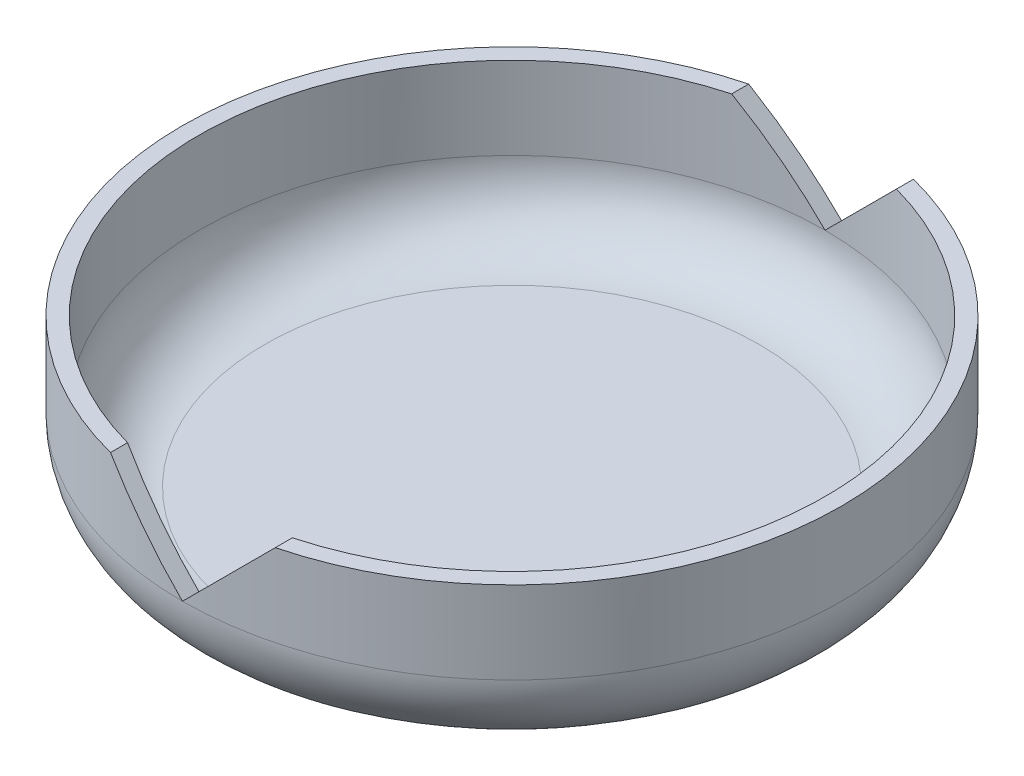
ISO-10303-21;
HEADER;
FILE_DESCRIPTION(('STEP AP214'),'2;1');
FILE_NAME('part.step','',(''),(''),'','','');
FILE_SCHEMA(('AUTOMOTIVE_DESIGN { 1 0 10303 214 1 1 1 1 }'));
ENDSEC;
DATA;
#1=APPLICATION_CONTEXT('core data for automotive mechanical design processes');
#2=APPLICATION_PROTOCOL_DEFINITION('international standard','automotive_design',2000,#1);
#3=PRODUCT_CONTEXT('',#1,'mechanical');
#4=PRODUCT('Part','Part','',(#3));
#5=PRODUCT_RELATED_PRODUCT_CATEGORY('part','',(#4));
#6=PRODUCT_DEFINITION_FORMATION('','',#4);
#7=PRODUCT_DEFINITION_CONTEXT('part definition',#1,'design');
#8=PRODUCT_DEFINITION('design','',#6,#7);
#9=PRODUCT_DEFINITION_SHAPE('','',#8);
#10=(LENGTH_UNIT() NAMED_UNIT(*) SI_UNIT(.MILLI.,.METRE.));
#11=(NAMED_UNIT(*) PLANE_ANGLE_UNIT() SI_UNIT($,.RADIAN.));
#12=(NAMED_UNIT(*) SI_UNIT($,.STERADIAN.) SOLID_ANGLE_UNIT());
#13=UNCERTAINTY_MEASURE_WITH_UNIT(LENGTH_MEASURE(1.E-05),#10,'distance_accuracy_value','');
#14=(GEOMETRIC_REPRESENTATION_CONTEXT(3) GLOBAL_UNCERTAINTY_ASSIGNED_CONTEXT((#13)) GLOBAL_UNIT_ASSIGNED_CONTEXT((#10,
#11,#12)) REPRESENTATION_CONTEXT('',''));
#15=CARTESIAN_POINT('',(0.,0.,0.));
#16=DIRECTION('',(0.,0.,1.));
#17=DIRECTION('',(1.,0.,0.));
#18=AXIS2_PLACEMENT_3D('',#15,#16,#17);
#19=CARTESIAN_POINT('',(0.,20.,0.));
#20=DIRECTION('',(0.,-1.,0.));
#21=DIRECTION('',(0.,0.,-1.));
#22=AXIS2_PLACEMENT_3D('',#19,#20,#21);
#23=CYLINDRICAL_SURFACE('',#22,40.);
#24=CARTESIAN_POINT('',(0.,10.,0.));
#25=DIRECTION('',(0.,1.,0.));
#26=DIRECTION('',(0.,0.,1.));
#27=AXIS2_PLACEMENT_3D('',#24,#25,#26);
#28=CIRCLE('',#27,40.);
#29=CARTESIAN_POINT('',(0.,10.,40.));
#30=VERTEX_POINT('',#29);
#31=CARTESIAN_POINT('',(0.,10.,-40.));
#32=VERTEX_POINT('',#31);
#33=EDGE_CURVE('E41',#30,#32,#28,.T.);
#34=ORIENTED_EDGE('',*,*,#33,.T.);
#35=CARTESIAN_POINT('',(0.,10.,0.));
#36=DIRECTION('',(0.70710678118655,-0.707106781186545,0.));
#37=DIRECTION('',(-0.707106781186545,-0.70710678118655,0.));
#38=AXIS2_PLACEMENT_3D('',#35,#36,#37);
#39=ELLIPSE('',#38,56.568542494924,40.);
#40=CARTESIAN_POINT('',(9.99999999999994,20.,-38.7298334620742));
#41=VERTEX_POINT('',#40);
#42=EDGE_CURVE('E114',#32,#41,#39,.T.);
#43=ORIENTED_EDGE('',*,*,#42,.T.);
#44=CARTESIAN_POINT('',(0.,20.,0.));
#45=DIRECTION('',(0.,1.,0.));
#46=DIRECTION('',(0.,0.,1.));
#47=AXIS2_PLACEMENT_3D('',#44,#45,#46);
#48=CIRCLE('',#47,40.);
#49=CARTESIAN_POINT('',(9.99999999999994,20.,38.7298334620742));
#50=VERTEX_POINT('',#49);
#51=EDGE_CURVE('E110',#50,#41,#48,.T.);
#52=ORIENTED_EDGE('',*,*,#51,.F.);
#53=EDGE_CURVE('E98',#50,#30,#39,.T.);
#54=ORIENTED_EDGE('',*,*,#53,.T.);
#55=EDGE_LOOP('',(#34,#43,#52,#54));
#56=FACE_BOUND('',#55,.T.);
#57=ADVANCED_FACE('F33',(#56),#23,.T.);
#58=CARTESIAN_POINT('',(0.,20.,0.));
#59=DIRECTION('',(0.,1.,0.));
#60=DIRECTION('',(0.,0.,1.));
#61=AXIS2_PLACEMENT_3D('',#58,#59,#60);
#62=PLANE('',#61);
#63=DIRECTION('',(0.,0.,-1.));
#64=VECTOR('',#63,1.);
#65=CARTESIAN_POINT('',(9.99999999999994,20.,0.));
#66=LINE('',#65,#64);
#67=CARTESIAN_POINT('',(9.99999999999994,20.,36.6606055596467));
#68=VERTEX_POINT('',#67);
#69=EDGE_CURVE('E112',#50,#68,#66,.T.);
#70=ORIENTED_EDGE('',*,*,#69,.F.);
#71=ORIENTED_EDGE('',*,*,#51,.T.);
#72=CARTESIAN_POINT('',(9.99999999999994,20.,-36.6606055596467));
#73=VERTEX_POINT('',#72);
#74=EDGE_CURVE('E135',#73,#41,#66,.T.);
#75=ORIENTED_EDGE('',*,*,#74,.F.);
#76=CARTESIAN_POINT('',(0.,20.,0.));
#77=DIRECTION('',(0.,1.,0.));
#78=DIRECTION('',(0.,0.,1.));
#79=AXIS2_PLACEMENT_3D('',#76,#77,#78);
#80=CIRCLE('',#79,38.);
#81=EDGE_CURVE('E124',#68,#73,#80,.T.);
#82=ORIENTED_EDGE('',*,*,#81,.F.);
#83=EDGE_LOOP('',(#70,#71,#75,#82));
#84=FACE_BOUND('',#83,.T.);
#85=ADVANCED_FACE('F161',(#84),#62,.T.);
#86=CARTESIAN_POINT('',(0.,20.,0.));
#87=DIRECTION('',(0.,-1.,0.));
#88=DIRECTION('',(0.,0.,-1.));
#89=AXIS2_PLACEMENT_3D('',#86,#87,#88);
#90=CYLINDRICAL_SURFACE('',#89,38.);
#91=CARTESIAN_POINT('',(0.,10.,0.));
#92=DIRECTION('',(0.70710678118655,-0.707106781186545,0.));
#93=DIRECTION('',(-0.707106781186545,-0.70710678118655,0.));
#94=AXIS2_PLACEMENT_3D('',#91,#92,#93);
#95=ELLIPSE('',#94,53.7401153701778,38.);
#96=CARTESIAN_POINT('',(0.,10.,38.));
#97=VERTEX_POINT('',#96);
#98=EDGE_CURVE('E92',#68,#97,#95,.T.);
#99=ORIENTED_EDGE('',*,*,#98,.F.);
#100=ORIENTED_EDGE('',*,*,#81,.T.);
#101=CARTESIAN_POINT('',(0.,10.,-38.));
#102=VERTEX_POINT('',#101);
#103=EDGE_CURVE('E111',#102,#73,#95,.T.);
#104=ORIENTED_EDGE('',*,*,#103,.F.);
#105=CARTESIAN_POINT('',(0.,10.,0.));
#106=DIRECTION('',(0.,-1.,0.));
#107=DIRECTION('',(0.,0.,-1.));
#108=AXIS2_PLACEMENT_3D('',#105,#106,#107);
#109=CIRCLE('',#108,38.);
#110=EDGE_CURVE('E127',#97,#102,#109,.F.);
#111=ORIENTED_EDGE('',*,*,#110,.F.);
#112=EDGE_LOOP('',(#99,#100,#104,#111));
#113=FACE_BOUND('',#112,.T.);
#114=ADVANCED_FACE('F149',(#113),#90,.F.);
#115=CARTESIAN_POINT('',(-10.0000000000001,20.,-38.7298334620742));
#116=VERTEX_POINT('',#115);
#117=CARTESIAN_POINT('',(-10.0000000000001,20.,38.7298334620742));
#118=VERTEX_POINT('',#117);
#119=EDGE_CURVE('E121',#116,#118,#48,.T.);
#120=ORIENTED_EDGE('',*,*,#119,.F.);
#121=CARTESIAN_POINT('',(0.,10.,0.));
#122=DIRECTION('',(-0.707106781186546,-0.70710678118655,0.));
#123=DIRECTION('',(0.70710678118655,-0.707106781186546,0.));
#124=AXIS2_PLACEMENT_3D('',#121,#122,#123);
#125=ELLIPSE('',#124,56.5685424949236,40.);
#126=EDGE_CURVE('E94',#116,#32,#125,.T.);
#127=ORIENTED_EDGE('',*,*,#126,.T.);
#128=EDGE_CURVE('E117',#32,#30,#28,.T.);
#129=ORIENTED_EDGE('',*,*,#128,.T.);
#130=EDGE_CURVE('E84',#30,#118,#125,.T.);
#131=ORIENTED_EDGE('',*,*,#130,.T.);
#132=EDGE_LOOP('',(#120,#127,#129,#131));
#133=FACE_BOUND('',#132,.T.);
#134=ADVANCED_FACE('F118',(#133),#23,.T.);
#135=DIRECTION('',(0.,0.,1.));
#136=VECTOR('',#135,1.);
#137=CARTESIAN_POINT('',(-10.0000000000001,20.,0.));
#138=LINE('',#137,#136);
#139=CARTESIAN_POINT('',(-10.0000000000001,20.,-36.6606055596467));
#140=VERTEX_POINT('',#139);
#141=EDGE_CURVE('E48',#116,#140,#138,.T.);
#142=ORIENTED_EDGE('',*,*,#141,.F.);
#143=ORIENTED_EDGE('',*,*,#119,.T.);
#144=CARTESIAN_POINT('',(-10.0000000000001,20.,36.6606055596467));
#145=VERTEX_POINT('',#144);
#146=EDGE_CURVE('E87',#145,#118,#138,.T.);
#147=ORIENTED_EDGE('',*,*,#146,.F.);
#148=EDGE_CURVE('E128',#140,#145,#80,.T.);
#149=ORIENTED_EDGE('',*,*,#148,.F.);
#150=EDGE_LOOP('',(#142,#143,#147,#149));
#151=FACE_BOUND('',#150,.T.);
#152=ADVANCED_FACE('F159',(#151),#62,.T.);
#153=CARTESIAN_POINT('',(0.,0.,0.));
#154=DIRECTION('',(0.,1.,0.));
#155=DIRECTION('',(0.,0.,1.));
#156=AXIS2_PLACEMENT_3D('',#153,#154,#155);
#157=PLANE('',#156);
#158=CARTESIAN_POINT('',(0.,0.,0.));
#159=DIRECTION('',(0.,1.,0.));
#160=DIRECTION('',(0.,0.,1.));
#161=AXIS2_PLACEMENT_3D('',#158,#159,#160);
#162=CIRCLE('',#161,30.);
#163=CARTESIAN_POINT('',(0.,0.,30.));
#164=VERTEX_POINT('',#163);
#165=EDGE_CURVE('E11',#164,#164,#162,.F.);
#166=ORIENTED_EDGE('',*,*,#165,.T.);
#167=EDGE_LOOP('',(#166));
#168=FACE_BOUND('',#167,.T.);
#169=ADVANCED_FACE('F172',(#168),#157,.F.);
#170=CARTESIAN_POINT('',(0.,10.,0.));
#171=DIRECTION('',(0.,1.,0.));
#172=DIRECTION('',(0.,0.,1.));
#173=AXIS2_PLACEMENT_3D('',#170,#171,#172);
#174=TOROIDAL_SURFACE('',#173,30.,10.);
#175=ORIENTED_EDGE('',*,*,#165,.F.);
#176=EDGE_LOOP('',(#175));
#177=FACE_BOUND('',#176,.T.);
#178=ORIENTED_EDGE('',*,*,#33,.F.);
#179=ORIENTED_EDGE('',*,*,#128,.F.);
#180=EDGE_LOOP('',(#178,#179));
#181=FACE_BOUND('',#180,.T.);
#182=ADVANCED_FACE('F35',(#177,#181),#174,.T.);
#183=CARTESIAN_POINT('',(0.,10.,0.));
#184=DIRECTION('',(-0.707106781186546,-0.70710678118655,0.));
#185=DIRECTION('',(0.70710678118655,-0.707106781186546,0.));
#186=AXIS2_PLACEMENT_3D('',#183,#184,#185);
#187=ELLIPSE('',#186,53.7401153701775,38.);
#188=EDGE_CURVE('E137',#97,#145,#187,.T.);
#189=ORIENTED_EDGE('',*,*,#188,.F.);
#190=EDGE_CURVE('E131',#102,#97,#109,.F.);
#191=ORIENTED_EDGE('',*,*,#190,.F.);
#192=EDGE_CURVE('E139',#140,#102,#187,.T.);
#193=ORIENTED_EDGE('',*,*,#192,.F.);
#194=ORIENTED_EDGE('',*,*,#148,.T.);
#195=EDGE_LOOP('',(#189,#191,#193,#194));
#196=FACE_BOUND('',#195,.T.);
#197=ADVANCED_FACE('F155',(#196),#90,.F.);
#198=CARTESIAN_POINT('',(0.,2.,0.));
#199=DIRECTION('',(0.,1.,0.));
#200=DIRECTION('',(0.,0.,1.));
#201=AXIS2_PLACEMENT_3D('',#198,#199,#200);
#202=PLANE('',#201);
#203=CARTESIAN_POINT('',(0.,2.,0.));
#204=DIRECTION('',(0.,1.,0.));
#205=DIRECTION('',(0.,0.,1.));
#206=AXIS2_PLACEMENT_3D('',#203,#204,#205);
#207=CIRCLE('',#206,30.);
#208=CARTESIAN_POINT('',(0.,2.,30.));
#209=VERTEX_POINT('',#208);
#210=EDGE_CURVE('E123',#209,#209,#207,.F.);
#211=ORIENTED_EDGE('',*,*,#210,.F.);
#212=EDGE_LOOP('',(#211));
#213=FACE_BOUND('',#212,.T.);
#214=ADVANCED_FACE('F201',(#213),#202,.T.);
#215=CARTESIAN_POINT('',(0.,10.,0.));
#216=DIRECTION('',(0.,1.,0.));
#217=DIRECTION('',(0.,0.,1.));
#218=AXIS2_PLACEMENT_3D('',#215,#216,#217);
#219=TOROIDAL_SURFACE('',#218,30.,8.);
#220=ORIENTED_EDGE('',*,*,#210,.T.);
#221=EDGE_LOOP('',(#220));
#222=FACE_BOUND('',#221,.T.);
#223=ORIENTED_EDGE('',*,*,#190,.T.);
#224=ORIENTED_EDGE('',*,*,#110,.T.);
#225=EDGE_LOOP('',(#223,#224));
#226=FACE_BOUND('',#225,.T.);
#227=ADVANCED_FACE('F153',(#222,#226),#219,.F.);
#228=CARTESIAN_POINT('',(-17.4587370840057,27.4587370840056,-40.));
#229=DIRECTION('',(-0.707106781186546,-0.70710678118655,0.));
#230=DIRECTION('',(0.70710678118655,-0.707106781186546,0.));
#231=AXIS2_PLACEMENT_3D('',#228,#229,#230);
#232=PLANE('',#231);
#233=ORIENTED_EDGE('',*,*,#141,.T.);
#234=ORIENTED_EDGE('',*,*,#192,.T.);
#235=DIRECTION('',(0.,0.,1.));
#236=VECTOR('',#235,1.);
#237=CARTESIAN_POINT('',(0.,10.,-40.));
#238=LINE('',#237,#236);
#239=EDGE_CURVE('E102',#32,#102,#238,.T.);
#240=ORIENTED_EDGE('',*,*,#239,.F.);
#241=ORIENTED_EDGE('',*,*,#126,.F.);
#242=EDGE_LOOP('',(#233,#234,#240,#241));
#243=FACE_BOUND('',#242,.T.);
#244=ADVANCED_FACE('F234',(#243),#232,.F.);
#245=CARTESIAN_POINT('',(0.,10.,-40.));
#246=DIRECTION('',(0.70710678118655,-0.707106781186545,0.));
#247=DIRECTION('',(0.707106781186545,0.70710678118655,0.));
#248=AXIS2_PLACEMENT_3D('',#245,#246,#247);
#249=PLANE('',#248);
#250=ORIENTED_EDGE('',*,*,#239,.T.);
#251=ORIENTED_EDGE('',*,*,#103,.T.);
#252=ORIENTED_EDGE('',*,*,#74,.T.);
#253=ORIENTED_EDGE('',*,*,#42,.F.);
#254=EDGE_LOOP('',(#250,#251,#252,#253));
#255=FACE_BOUND('',#254,.T.);
#256=ADVANCED_FACE('F144',(#255),#249,.F.);
#257=ORIENTED_EDGE('',*,*,#69,.T.);
#258=ORIENTED_EDGE('',*,*,#98,.T.);
#259=EDGE_CURVE('E56',#97,#30,#238,.T.);
#260=ORIENTED_EDGE('',*,*,#259,.T.);
#261=ORIENTED_EDGE('',*,*,#53,.F.);
#262=EDGE_LOOP('',(#257,#258,#260,#261));
#263=FACE_BOUND('',#262,.T.);
#264=ADVANCED_FACE('F97',(#263),#249,.F.);
#265=ORIENTED_EDGE('',*,*,#259,.F.);
#266=ORIENTED_EDGE('',*,*,#188,.T.);
#267=ORIENTED_EDGE('',*,*,#146,.T.);
#268=ORIENTED_EDGE('',*,*,#130,.F.);
#269=EDGE_LOOP('',(#265,#266,#267,#268));
#270=FACE_BOUND('',#269,.T.);
#271=ADVANCED_FACE('F85',(#270),#232,.F.);
#272=CLOSED_SHELL('',(#57,#85,#114,#134,#152,#169,#182,#197,#214,#227,#244,#256,#264,#271));
#273=MANIFOLD_SOLID_BREP('B2',#272);
#274=ADVANCED_BREP_SHAPE_REPRESENTATION('',(#18,#273),#14);
#275=SHAPE_DEFINITION_REPRESENTATION(#9,#274);
ENDSEC;
END-ISO-10303-21;
